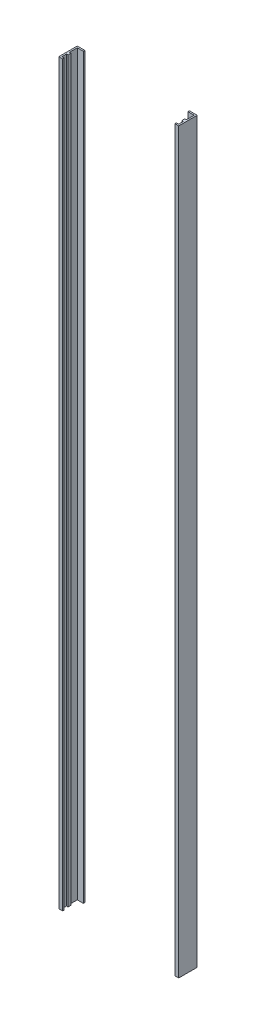
ISO-10303-21;
HEADER;
FILE_DESCRIPTION(('STEP AP214'),'2;1');
FILE_NAME('part.step','',(''),(''),'','','');
FILE_SCHEMA(('AUTOMOTIVE_DESIGN { 1 0 10303 214 1 1 1 1 }'));
ENDSEC;
DATA;
#1=APPLICATION_CONTEXT('core data for automotive mechanical design processes');
#2=APPLICATION_PROTOCOL_DEFINITION('international standard','automotive_design',2000,#1);
#3=PRODUCT_CONTEXT('',#1,'mechanical');
#4=PRODUCT('Part','Part','',(#3));
#5=PRODUCT_RELATED_PRODUCT_CATEGORY('part','',(#4));
#6=PRODUCT_DEFINITION_FORMATION('','',#4);
#7=PRODUCT_DEFINITION_CONTEXT('part definition',#1,'design');
#8=PRODUCT_DEFINITION('design','',#6,#7);
#9=PRODUCT_DEFINITION_SHAPE('','',#8);
#10=(LENGTH_UNIT() NAMED_UNIT(*) SI_UNIT(.MILLI.,.METRE.));
#11=(NAMED_UNIT(*) PLANE_ANGLE_UNIT() SI_UNIT($,.RADIAN.));
#12=(NAMED_UNIT(*) SI_UNIT($,.STERADIAN.) SOLID_ANGLE_UNIT());
#13=UNCERTAINTY_MEASURE_WITH_UNIT(LENGTH_MEASURE(1.E-05),#10,'distance_accuracy_value','');
#14=(GEOMETRIC_REPRESENTATION_CONTEXT(3) GLOBAL_UNCERTAINTY_ASSIGNED_CONTEXT((#13)) GLOBAL_UNIT_ASSIGNED_CONTEXT((#10,
#11,#12)) REPRESENTATION_CONTEXT('',''));
#15=CARTESIAN_POINT('',(0.,0.,0.));
#16=DIRECTION('',(0.,0.,1.));
#17=DIRECTION('',(1.,0.,0.));
#18=AXIS2_PLACEMENT_3D('',#15,#16,#17);
#19=CARTESIAN_POINT('',(92.71,1219.2,0.));
#20=DIRECTION('',(0.,0.,-1.));
#21=DIRECTION('',(-1.,0.,0.));
#22=AXIS2_PLACEMENT_3D('',#19,#20,#21);
#23=PLANE('',#22);
#24=DIRECTION('',(1.,0.,0.));
#25=VECTOR('',#24,1.);
#26=CARTESIAN_POINT('',(92.71,0.,0.));
#27=LINE('',#26,#25);
#28=CARTESIAN_POINT('',(92.71,0.,0.));
#29=VERTEX_POINT('',#28);
#30=CARTESIAN_POINT('',(99.06,0.,0.));
#31=VERTEX_POINT('',#30);
#32=EDGE_CURVE('E12',#29,#31,#27,.T.);
#33=ORIENTED_EDGE('',*,*,#32,.T.);
#34=DIRECTION('',(0.,-1.,0.));
#35=VECTOR('',#34,1.);
#36=CARTESIAN_POINT('',(99.06,1219.2,0.));
#37=LINE('',#36,#35);
#38=CARTESIAN_POINT('',(99.06,1219.2,0.));
#39=VERTEX_POINT('',#38);
#40=EDGE_CURVE('E380',#39,#31,#37,.T.);
#41=ORIENTED_EDGE('',*,*,#40,.F.);
#42=DIRECTION('',(1.,0.,0.));
#43=VECTOR('',#42,1.);
#44=CARTESIAN_POINT('',(92.71,1219.2,0.));
#45=LINE('',#44,#43);
#46=CARTESIAN_POINT('',(92.71,1219.2,0.));
#47=VERTEX_POINT('',#46);
#48=EDGE_CURVE('E51',#47,#39,#45,.T.);
#49=ORIENTED_EDGE('',*,*,#48,.F.);
#50=DIRECTION('',(0.,-1.,0.));
#51=VECTOR('',#50,1.);
#52=CARTESIAN_POINT('',(92.71,1219.2,0.));
#53=LINE('',#52,#51);
#54=EDGE_CURVE('E175',#47,#29,#53,.T.);
#55=ORIENTED_EDGE('',*,*,#54,.T.);
#56=EDGE_LOOP('',(#33,#41,#49,#55));
#57=FACE_BOUND('',#56,.T.);
#58=ADVANCED_FACE('F47',(#57),#23,.F.);
#59=CARTESIAN_POINT('',(99.06,1219.2,0.));
#60=DIRECTION('',(-1.,0.,0.));
#61=DIRECTION('',(0.,0.,1.));
#62=AXIS2_PLACEMENT_3D('',#59,#60,#61);
#63=PLANE('',#62);
#64=DIRECTION('',(0.,0.,-1.));
#65=VECTOR('',#64,1.);
#66=CARTESIAN_POINT('',(99.06,0.,0.));
#67=LINE('',#66,#65);
#68=CARTESIAN_POINT('',(99.06,0.,-30.48));
#69=VERTEX_POINT('',#68);
#70=EDGE_CURVE('E57',#31,#69,#67,.T.);
#71=ORIENTED_EDGE('',*,*,#70,.T.);
#72=DIRECTION('',(0.,-1.,0.));
#73=VECTOR('',#72,1.);
#74=CARTESIAN_POINT('',(99.06,1219.2,-30.48));
#75=LINE('',#74,#73);
#76=CARTESIAN_POINT('',(99.06,1219.2,-30.48));
#77=VERTEX_POINT('',#76);
#78=EDGE_CURVE('E150',#77,#69,#75,.T.);
#79=ORIENTED_EDGE('',*,*,#78,.F.);
#80=DIRECTION('',(0.,0.,-1.));
#81=VECTOR('',#80,1.);
#82=CARTESIAN_POINT('',(99.06,1219.2,0.));
#83=LINE('',#82,#81);
#84=EDGE_CURVE('E105',#39,#77,#83,.T.);
#85=ORIENTED_EDGE('',*,*,#84,.F.);
#86=ORIENTED_EDGE('',*,*,#40,.T.);
#87=EDGE_LOOP('',(#71,#79,#85,#86));
#88=FACE_BOUND('',#87,.T.);
#89=ADVANCED_FACE('F271',(#88),#63,.F.);
#90=CARTESIAN_POINT('',(92.71,1219.2,-30.48));
#91=DIRECTION('',(0.,0.,1.));
#92=DIRECTION('',(1.,0.,0.));
#93=AXIS2_PLACEMENT_3D('',#90,#91,#92);
#94=PLANE('',#93);
#95=DIRECTION('',(-1.,0.,0.));
#96=VECTOR('',#95,1.);
#97=CARTESIAN_POINT('',(92.71,0.,-30.48));
#98=LINE('',#97,#96);
#99=CARTESIAN_POINT('',(86.3599999999999,0.,-30.48));
#100=VERTEX_POINT('',#99);
#101=EDGE_CURVE('E144',#69,#100,#98,.T.);
#102=ORIENTED_EDGE('',*,*,#101,.T.);
#103=DIRECTION('',(0.,-1.,0.));
#104=VECTOR('',#103,1.);
#105=CARTESIAN_POINT('',(86.3599999999999,1219.2,-30.48));
#106=LINE('',#105,#104);
#107=CARTESIAN_POINT('',(86.3599999999999,1219.2,-30.48));
#108=VERTEX_POINT('',#107);
#109=EDGE_CURVE('E148',#108,#100,#106,.T.);
#110=ORIENTED_EDGE('',*,*,#109,.F.);
#111=DIRECTION('',(-1.,0.,0.));
#112=VECTOR('',#111,1.);
#113=CARTESIAN_POINT('',(99.06,1219.2,-30.48));
#114=LINE('',#113,#112);
#115=EDGE_CURVE('E196',#77,#108,#114,.T.);
#116=ORIENTED_EDGE('',*,*,#115,.F.);
#117=ORIENTED_EDGE('',*,*,#78,.T.);
#118=EDGE_LOOP('',(#102,#110,#116,#117));
#119=FACE_BOUND('',#118,.T.);
#120=ADVANCED_FACE('F146',(#119),#94,.F.);
#121=CARTESIAN_POINT('',(86.3599999999999,1219.2,-30.48));
#122=DIRECTION('',(1.,0.,0.));
#123=DIRECTION('',(0.,0.,-1.));
#124=AXIS2_PLACEMENT_3D('',#121,#122,#123);
#125=PLANE('',#124);
#126=DIRECTION('',(0.,0.,1.));
#127=VECTOR('',#126,1.);
#128=CARTESIAN_POINT('',(86.3599999999999,0.,-30.48));
#129=LINE('',#128,#127);
#130=CARTESIAN_POINT('',(86.3599999999999,0.,-27.94));
#131=VERTEX_POINT('',#130);
#132=EDGE_CURVE('E152',#100,#131,#129,.T.);
#133=ORIENTED_EDGE('',*,*,#132,.T.);
#134=DIRECTION('',(0.,-1.,0.));
#135=VECTOR('',#134,1.);
#136=CARTESIAN_POINT('',(86.3599999999999,1219.2,-27.94));
#137=LINE('',#136,#135);
#138=CARTESIAN_POINT('',(86.3599999999999,1219.2,-27.94));
#139=VERTEX_POINT('',#138);
#140=EDGE_CURVE('E160',#139,#131,#137,.T.);
#141=ORIENTED_EDGE('',*,*,#140,.F.);
#142=DIRECTION('',(0.,0.,1.));
#143=VECTOR('',#142,1.);
#144=CARTESIAN_POINT('',(86.3599999999999,1219.2,-30.48));
#145=LINE('',#144,#143);
#146=EDGE_CURVE('E159',#108,#139,#145,.T.);
#147=ORIENTED_EDGE('',*,*,#146,.F.);
#148=ORIENTED_EDGE('',*,*,#109,.T.);
#149=EDGE_LOOP('',(#133,#141,#147,#148));
#150=FACE_BOUND('',#149,.T.);
#151=ADVANCED_FACE('F156',(#150),#125,.F.);
#152=CARTESIAN_POINT('',(96.52,1219.2,-27.94));
#153=DIRECTION('',(0.,0.,1.));
#154=DIRECTION('',(1.,0.,0.));
#155=AXIS2_PLACEMENT_3D('',#152,#153,#154);
#156=PLANE('',#155);
#157=DIRECTION('',(-1.,0.,0.));
#158=VECTOR('',#157,1.);
#159=CARTESIAN_POINT('',(96.52,0.,-27.94));
#160=LINE('',#159,#158);
#161=CARTESIAN_POINT('',(96.52,0.,-27.94));
#162=VERTEX_POINT('',#161);
#163=EDGE_CURVE('E165',#162,#131,#160,.T.);
#164=ORIENTED_EDGE('',*,*,#163,.F.);
#165=DIRECTION('',(0.,-1.,0.));
#166=VECTOR('',#165,1.);
#167=CARTESIAN_POINT('',(96.52,1219.2,-27.94));
#168=LINE('',#167,#166);
#169=CARTESIAN_POINT('',(96.52,1219.2,-27.94));
#170=VERTEX_POINT('',#169);
#171=EDGE_CURVE('E224',#170,#162,#168,.T.);
#172=ORIENTED_EDGE('',*,*,#171,.F.);
#173=DIRECTION('',(1.,0.,0.));
#174=VECTOR('',#173,1.);
#175=CARTESIAN_POINT('',(86.3599999999999,1219.2,-27.94));
#176=LINE('',#175,#174);
#177=EDGE_CURVE('E193',#139,#170,#176,.T.);
#178=ORIENTED_EDGE('',*,*,#177,.F.);
#179=ORIENTED_EDGE('',*,*,#140,.T.);
#180=EDGE_LOOP('',(#164,#172,#178,#179));
#181=FACE_BOUND('',#180,.T.);
#182=ADVANCED_FACE('F228',(#181),#156,.T.);
#183=CARTESIAN_POINT('',(96.52,1219.2,-15.24));
#184=DIRECTION('',(-1.,0.,0.));
#185=DIRECTION('',(0.,0.,1.));
#186=AXIS2_PLACEMENT_3D('',#183,#184,#185);
#187=PLANE('',#186);
#188=DIRECTION('',(0.,0.,-1.));
#189=VECTOR('',#188,1.);
#190=CARTESIAN_POINT('',(96.52,0.,-15.24));
#191=LINE('',#190,#189);
#192=CARTESIAN_POINT('',(96.52,0.,-15.24));
#193=VERTEX_POINT('',#192);
#194=EDGE_CURVE('E167',#193,#162,#191,.T.);
#195=ORIENTED_EDGE('',*,*,#194,.F.);
#196=DIRECTION('',(0.,-1.,0.));
#197=VECTOR('',#196,1.);
#198=CARTESIAN_POINT('',(96.52,1219.2,-15.24));
#199=LINE('',#198,#197);
#200=CARTESIAN_POINT('',(96.52,1219.2,-15.24));
#201=VERTEX_POINT('',#200);
#202=EDGE_CURVE('E221',#201,#193,#199,.T.);
#203=ORIENTED_EDGE('',*,*,#202,.F.);
#204=DIRECTION('',(0.,0.,-1.));
#205=VECTOR('',#204,1.);
#206=CARTESIAN_POINT('',(96.52,1219.2,-15.24));
#207=LINE('',#206,#205);
#208=EDGE_CURVE('E190',#201,#170,#207,.T.);
#209=ORIENTED_EDGE('',*,*,#208,.T.);
#210=ORIENTED_EDGE('',*,*,#171,.T.);
#211=EDGE_LOOP('',(#195,#203,#209,#210));
#212=FACE_BOUND('',#211,.T.);
#213=ADVANCED_FACE('F220',(#212),#187,.T.);
#214=CARTESIAN_POINT('',(93.98,1219.2,-15.24));
#215=DIRECTION('',(0.,0.,-1.));
#216=DIRECTION('',(-1.,0.,0.));
#217=AXIS2_PLACEMENT_3D('',#214,#215,#216);
#218=PLANE('',#217);
#219=DIRECTION('',(1.,0.,0.));
#220=VECTOR('',#219,1.);
#221=CARTESIAN_POINT('',(93.98,0.,-15.24));
#222=LINE('',#221,#220);
#223=CARTESIAN_POINT('',(93.98,0.,-15.24));
#224=VERTEX_POINT('',#223);
#225=EDGE_CURVE('E215',#224,#193,#222,.T.);
#226=ORIENTED_EDGE('',*,*,#225,.F.);
#227=DIRECTION('',(0.,-1.,0.));
#228=VECTOR('',#227,1.);
#229=CARTESIAN_POINT('',(93.98,1219.2,-15.24));
#230=LINE('',#229,#228);
#231=CARTESIAN_POINT('',(93.98,1219.2,-15.24));
#232=VERTEX_POINT('',#231);
#233=EDGE_CURVE('E233',#232,#224,#230,.T.);
#234=ORIENTED_EDGE('',*,*,#233,.F.);
#235=DIRECTION('',(1.,0.,0.));
#236=VECTOR('',#235,1.);
#237=CARTESIAN_POINT('',(93.98,1219.2,-15.24));
#238=LINE('',#237,#236);
#239=EDGE_CURVE('E187',#232,#201,#238,.T.);
#240=ORIENTED_EDGE('',*,*,#239,.T.);
#241=ORIENTED_EDGE('',*,*,#202,.T.);
#242=EDGE_LOOP('',(#226,#234,#240,#241));
#243=FACE_BOUND('',#242,.T.);
#244=ADVANCED_FACE('F261',(#243),#218,.T.);
#245=CARTESIAN_POINT('',(93.98,1219.2,-10.16));
#246=DIRECTION('',(-1.,0.,0.));
#247=DIRECTION('',(0.,0.,1.));
#248=AXIS2_PLACEMENT_3D('',#245,#246,#247);
#249=PLANE('',#248);
#250=DIRECTION('',(0.,0.,-1.));
#251=VECTOR('',#250,1.);
#252=CARTESIAN_POINT('',(93.98,0.,-10.16));
#253=LINE('',#252,#251);
#254=CARTESIAN_POINT('',(93.98,0.,-10.16));
#255=VERTEX_POINT('',#254);
#256=EDGE_CURVE('E212',#255,#224,#253,.T.);
#257=ORIENTED_EDGE('',*,*,#256,.F.);
#258=DIRECTION('',(0.,-1.,0.));
#259=VECTOR('',#258,1.);
#260=CARTESIAN_POINT('',(93.98,1219.2,-10.16));
#261=LINE('',#260,#259);
#262=CARTESIAN_POINT('',(93.98,1219.2,-10.16));
#263=VERTEX_POINT('',#262);
#264=EDGE_CURVE('E235',#263,#255,#261,.T.);
#265=ORIENTED_EDGE('',*,*,#264,.F.);
#266=DIRECTION('',(0.,0.,-1.));
#267=VECTOR('',#266,1.);
#268=CARTESIAN_POINT('',(93.98,1219.2,-10.16));
#269=LINE('',#268,#267);
#270=EDGE_CURVE('E184',#263,#232,#269,.T.);
#271=ORIENTED_EDGE('',*,*,#270,.T.);
#272=ORIENTED_EDGE('',*,*,#233,.T.);
#273=EDGE_LOOP('',(#257,#265,#271,#272));
#274=FACE_BOUND('',#273,.T.);
#275=ADVANCED_FACE('F258',(#274),#249,.T.);
#276=CARTESIAN_POINT('',(96.52,1219.2,-10.16));
#277=DIRECTION('',(0.,0.,1.));
#278=DIRECTION('',(1.,0.,0.));
#279=AXIS2_PLACEMENT_3D('',#276,#277,#278);
#280=PLANE('',#279);
#281=DIRECTION('',(-1.,0.,0.));
#282=VECTOR('',#281,1.);
#283=CARTESIAN_POINT('',(96.52,0.,-10.16));
#284=LINE('',#283,#282);
#285=CARTESIAN_POINT('',(96.52,0.,-10.16));
#286=VERTEX_POINT('',#285);
#287=EDGE_CURVE('E209',#286,#255,#284,.T.);
#288=ORIENTED_EDGE('',*,*,#287,.F.);
#289=DIRECTION('',(0.,-1.,0.));
#290=VECTOR('',#289,1.);
#291=CARTESIAN_POINT('',(96.52,1219.2,-10.16));
#292=LINE('',#291,#290);
#293=CARTESIAN_POINT('',(96.52,1219.2,-10.16));
#294=VERTEX_POINT('',#293);
#295=EDGE_CURVE('E237',#294,#286,#292,.T.);
#296=ORIENTED_EDGE('',*,*,#295,.F.);
#297=DIRECTION('',(-1.,0.,0.));
#298=VECTOR('',#297,1.);
#299=CARTESIAN_POINT('',(96.52,1219.2,-10.16));
#300=LINE('',#299,#298);
#301=EDGE_CURVE('E181',#294,#263,#300,.T.);
#302=ORIENTED_EDGE('',*,*,#301,.T.);
#303=ORIENTED_EDGE('',*,*,#264,.T.);
#304=EDGE_LOOP('',(#288,#296,#302,#303));
#305=FACE_BOUND('',#304,.T.);
#306=ADVANCED_FACE('F254',(#305),#280,.T.);
#307=CARTESIAN_POINT('',(96.52,1219.2,-2.53999999999999));
#308=DIRECTION('',(-1.,0.,0.));
#309=DIRECTION('',(0.,0.,1.));
#310=AXIS2_PLACEMENT_3D('',#307,#308,#309);
#311=PLANE('',#310);
#312=DIRECTION('',(0.,0.,-1.));
#313=VECTOR('',#312,1.);
#314=CARTESIAN_POINT('',(96.52,0.,-2.53999999999999));
#315=LINE('',#314,#313);
#316=CARTESIAN_POINT('',(96.52,0.,-2.53999999999999));
#317=VERTEX_POINT('',#316);
#318=EDGE_CURVE('E202',#317,#286,#315,.T.);
#319=ORIENTED_EDGE('',*,*,#318,.F.);
#320=DIRECTION('',(0.,-1.,0.));
#321=VECTOR('',#320,1.);
#322=CARTESIAN_POINT('',(96.52,1219.2,-2.53999999999999));
#323=LINE('',#322,#321);
#324=CARTESIAN_POINT('',(96.52,1219.2,-2.53999999999999));
#325=VERTEX_POINT('',#324);
#326=EDGE_CURVE('E239',#325,#317,#323,.T.);
#327=ORIENTED_EDGE('',*,*,#326,.F.);
#328=DIRECTION('',(0.,0.,-1.));
#329=VECTOR('',#328,1.);
#330=CARTESIAN_POINT('',(96.52,1219.2,-2.53999999999999));
#331=LINE('',#330,#329);
#332=EDGE_CURVE('E178',#325,#294,#331,.T.);
#333=ORIENTED_EDGE('',*,*,#332,.T.);
#334=ORIENTED_EDGE('',*,*,#295,.T.);
#335=EDGE_LOOP('',(#319,#327,#333,#334));
#336=FACE_BOUND('',#335,.T.);
#337=ADVANCED_FACE('F250',(#336),#311,.T.);
#338=CARTESIAN_POINT('',(92.71,1219.2,-2.53999999999999));
#339=DIRECTION('',(0.,0.,-1.));
#340=DIRECTION('',(-1.,0.,0.));
#341=AXIS2_PLACEMENT_3D('',#338,#339,#340);
#342=PLANE('',#341);
#343=DIRECTION('',(1.,0.,0.));
#344=VECTOR('',#343,1.);
#345=CARTESIAN_POINT('',(92.71,0.,-2.53999999999999));
#346=LINE('',#345,#344);
#347=CARTESIAN_POINT('',(92.71,0.,-2.53999999999999));
#348=VERTEX_POINT('',#347);
#349=EDGE_CURVE('E199',#348,#317,#346,.T.);
#350=ORIENTED_EDGE('',*,*,#349,.F.);
#351=DIRECTION('',(0.,-1.,0.));
#352=VECTOR('',#351,1.);
#353=CARTESIAN_POINT('',(92.71,1219.2,-2.53999999999999));
#354=LINE('',#353,#352);
#355=CARTESIAN_POINT('',(92.71,1219.2,-2.53999999999999));
#356=VERTEX_POINT('',#355);
#357=EDGE_CURVE('E240',#356,#348,#354,.T.);
#358=ORIENTED_EDGE('',*,*,#357,.F.);
#359=DIRECTION('',(1.,0.,0.));
#360=VECTOR('',#359,1.);
#361=CARTESIAN_POINT('',(92.71,1219.2,-2.53999999999999));
#362=LINE('',#361,#360);
#363=EDGE_CURVE('E174',#356,#325,#362,.T.);
#364=ORIENTED_EDGE('',*,*,#363,.T.);
#365=ORIENTED_EDGE('',*,*,#326,.T.);
#366=EDGE_LOOP('',(#350,#358,#364,#365));
#367=FACE_BOUND('',#366,.T.);
#368=ADVANCED_FACE('F245',(#367),#342,.T.);
#369=CARTESIAN_POINT('',(92.71,1219.2,-2.53999999999999));
#370=DIRECTION('',(1.,0.,0.));
#371=DIRECTION('',(0.,0.,-1.));
#372=AXIS2_PLACEMENT_3D('',#369,#370,#371);
#373=PLANE('',#372);
#374=DIRECTION('',(0.,0.,1.));
#375=VECTOR('',#374,1.);
#376=CARTESIAN_POINT('',(92.71,0.,-2.53999999999999));
#377=LINE('',#376,#375);
#378=EDGE_CURVE('E116',#348,#29,#377,.T.);
#379=ORIENTED_EDGE('',*,*,#378,.T.);
#380=ORIENTED_EDGE('',*,*,#54,.F.);
#381=DIRECTION('',(0.,0.,1.));
#382=VECTOR('',#381,1.);
#383=CARTESIAN_POINT('',(92.71,1219.2,-2.53999999999999));
#384=LINE('',#383,#382);
#385=EDGE_CURVE('E172',#356,#47,#384,.T.);
#386=ORIENTED_EDGE('',*,*,#385,.F.);
#387=ORIENTED_EDGE('',*,*,#357,.T.);
#388=EDGE_LOOP('',(#379,#380,#386,#387));
#389=FACE_BOUND('',#388,.T.);
#390=ADVANCED_FACE('F262',(#389),#373,.F.);
#391=CARTESIAN_POINT('',(0.,1219.2,0.));
#392=DIRECTION('',(0.,1.,0.));
#393=DIRECTION('',(0.,0.,1.));
#394=AXIS2_PLACEMENT_3D('',#391,#392,#393);
#395=PLANE('',#394);
#396=ORIENTED_EDGE('',*,*,#48,.T.);
#397=ORIENTED_EDGE('',*,*,#84,.T.);
#398=ORIENTED_EDGE('',*,*,#115,.T.);
#399=ORIENTED_EDGE('',*,*,#146,.T.);
#400=ORIENTED_EDGE('',*,*,#177,.T.);
#401=ORIENTED_EDGE('',*,*,#208,.F.);
#402=ORIENTED_EDGE('',*,*,#239,.F.);
#403=ORIENTED_EDGE('',*,*,#270,.F.);
#404=ORIENTED_EDGE('',*,*,#301,.F.);
#405=ORIENTED_EDGE('',*,*,#332,.F.);
#406=ORIENTED_EDGE('',*,*,#363,.F.);
#407=ORIENTED_EDGE('',*,*,#385,.T.);
#408=EDGE_LOOP('',(#396,#397,#398,#399,#400,#401,#402,#403,#404,#405,#406,#407));
#409=FACE_BOUND('',#408,.T.);
#410=ADVANCED_FACE('F49',(#409),#395,.T.);
#411=CARTESIAN_POINT('',(0.,0.,0.));
#412=DIRECTION('',(0.,1.,0.));
#413=DIRECTION('',(0.,0.,1.));
#414=AXIS2_PLACEMENT_3D('',#411,#412,#413);
#415=PLANE('',#414);
#416=ORIENTED_EDGE('',*,*,#32,.F.);
#417=ORIENTED_EDGE('',*,*,#378,.F.);
#418=ORIENTED_EDGE('',*,*,#349,.T.);
#419=ORIENTED_EDGE('',*,*,#318,.T.);
#420=ORIENTED_EDGE('',*,*,#287,.T.);
#421=ORIENTED_EDGE('',*,*,#256,.T.);
#422=ORIENTED_EDGE('',*,*,#225,.T.);
#423=ORIENTED_EDGE('',*,*,#194,.T.);
#424=ORIENTED_EDGE('',*,*,#163,.T.);
#425=ORIENTED_EDGE('',*,*,#132,.F.);
#426=ORIENTED_EDGE('',*,*,#101,.F.);
#427=ORIENTED_EDGE('',*,*,#70,.F.);
#428=EDGE_LOOP('',(#416,#417,#418,#419,#420,#421,#422,#423,#424,#425,#426,#427));
#429=FACE_BOUND('',#428,.T.);
#430=ADVANCED_FACE('F162',(#429),#415,.F.);
#431=CLOSED_SHELL('',(#58,#89,#120,#151,#182,#213,#244,#275,#306,#337,#368,#390,#410,#430));
#432=MANIFOLD_SOLID_BREP('B2',#431);
#433=CARTESIAN_POINT('',(-86.36,1219.2,0.));
#434=DIRECTION('',(1.,0.,0.));
#435=DIRECTION('',(0.,0.,-1.));
#436=AXIS2_PLACEMENT_3D('',#433,#434,#435);
#437=PLANE('',#436);
#438=DIRECTION('',(0.,0.,1.));
#439=VECTOR('',#438,1.);
#440=CARTESIAN_POINT('',(-86.36,0.,0.));
#441=LINE('',#440,#439);
#442=CARTESIAN_POINT('',(-86.36,0.,-30.48));
#443=VERTEX_POINT('',#442);
#444=CARTESIAN_POINT('',(-86.36,0.,-27.94));
#445=VERTEX_POINT('',#444);
#446=EDGE_CURVE('E501',#443,#445,#441,.T.);
#447=ORIENTED_EDGE('',*,*,#446,.F.);
#448=DIRECTION('',(0.,-1.,0.));
#449=VECTOR('',#448,1.);
#450=CARTESIAN_POINT('',(-86.36,1219.2,-30.48));
#451=LINE('',#450,#449);
#452=CARTESIAN_POINT('',(-86.36,1219.2,-30.48));
#453=VERTEX_POINT('',#452);
#454=EDGE_CURVE('E45',#453,#443,#451,.T.);
#455=ORIENTED_EDGE('',*,*,#454,.F.);
#456=DIRECTION('',(0.,0.,1.));
#457=VECTOR('',#456,1.);
#458=CARTESIAN_POINT('',(-86.36,1219.2,0.));
#459=LINE('',#458,#457);
#460=CARTESIAN_POINT('',(-86.36,1219.2,-27.94));
#461=VERTEX_POINT('',#460);
#462=EDGE_CURVE('E528',#453,#461,#459,.T.);
#463=ORIENTED_EDGE('',*,*,#462,.T.);
#464=DIRECTION('',(0.,-1.,0.));
#465=VECTOR('',#464,1.);
#466=CARTESIAN_POINT('',(-86.36,1219.2,-27.94));
#467=LINE('',#466,#465);
#468=EDGE_CURVE('E448',#461,#445,#467,.T.);
#469=ORIENTED_EDGE('',*,*,#468,.T.);
#470=EDGE_LOOP('',(#447,#455,#463,#469));
#471=FACE_BOUND('',#470,.T.);
#472=ADVANCED_FACE('F385',(#471),#437,.T.);
#473=CARTESIAN_POINT('',(0.,1219.2,-30.48));
#474=DIRECTION('',(0.,0.,-1.));
#475=DIRECTION('',(-1.,0.,0.));
#476=AXIS2_PLACEMENT_3D('',#473,#474,#475);
#477=PLANE('',#476);
#478=DIRECTION('',(1.,0.,0.));
#479=VECTOR('',#478,1.);
#480=CARTESIAN_POINT('',(0.,0.,-30.48));
#481=LINE('',#480,#479);
#482=CARTESIAN_POINT('',(-99.06,0.,-30.48));
#483=VERTEX_POINT('',#482);
#484=EDGE_CURVE('E504',#483,#443,#481,.T.);
#485=ORIENTED_EDGE('',*,*,#484,.F.);
#486=DIRECTION('',(0.,-1.,0.));
#487=VECTOR('',#486,1.);
#488=CARTESIAN_POINT('',(-99.06,1219.2,-30.48));
#489=LINE('',#488,#487);
#490=CARTESIAN_POINT('',(-99.06,1219.2,-30.48));
#491=VERTEX_POINT('',#490);
#492=EDGE_CURVE('E393',#491,#483,#489,.T.);
#493=ORIENTED_EDGE('',*,*,#492,.F.);
#494=DIRECTION('',(1.,0.,0.));
#495=VECTOR('',#494,1.);
#496=CARTESIAN_POINT('',(0.,1219.2,-30.48));
#497=LINE('',#496,#495);
#498=EDGE_CURVE('E569',#491,#453,#497,.T.);
#499=ORIENTED_EDGE('',*,*,#498,.T.);
#500=ORIENTED_EDGE('',*,*,#454,.T.);
#501=EDGE_LOOP('',(#485,#493,#499,#500));
#502=FACE_BOUND('',#501,.T.);
#503=ADVANCED_FACE('F556',(#502),#477,.T.);
#504=CARTESIAN_POINT('',(-99.06,1219.2,0.));
#505=DIRECTION('',(-1.,0.,0.));
#506=DIRECTION('',(0.,0.,1.));
#507=AXIS2_PLACEMENT_3D('',#504,#505,#506);
#508=PLANE('',#507);
#509=DIRECTION('',(0.,0.,-1.));
#510=VECTOR('',#509,1.);
#511=CARTESIAN_POINT('',(-99.06,0.,0.));
#512=LINE('',#511,#510);
#513=CARTESIAN_POINT('',(-99.06,0.,0.));
#514=VERTEX_POINT('',#513);
#515=EDGE_CURVE('E507',#514,#483,#512,.T.);
#516=ORIENTED_EDGE('',*,*,#515,.F.);
#517=DIRECTION('',(0.,-1.,0.));
#518=VECTOR('',#517,1.);
#519=CARTESIAN_POINT('',(-99.06,1219.2,0.));
#520=LINE('',#519,#518);
#521=CARTESIAN_POINT('',(-99.06,1219.2,0.));
#522=VERTEX_POINT('',#521);
#523=EDGE_CURVE('E545',#522,#514,#520,.T.);
#524=ORIENTED_EDGE('',*,*,#523,.F.);
#525=DIRECTION('',(0.,0.,-1.));
#526=VECTOR('',#525,1.);
#527=CARTESIAN_POINT('',(-99.06,1219.2,0.));
#528=LINE('',#527,#526);
#529=EDGE_CURVE('E552',#522,#491,#528,.T.);
#530=ORIENTED_EDGE('',*,*,#529,.T.);
#531=ORIENTED_EDGE('',*,*,#492,.T.);
#532=EDGE_LOOP('',(#516,#524,#530,#531));
#533=FACE_BOUND('',#532,.T.);
#534=ADVANCED_FACE('F550',(#533),#508,.T.);
#535=CARTESIAN_POINT('',(0.,1219.2,-5.19930285413798E-13));
#536=DIRECTION('',(0.,0.,1.));
#537=DIRECTION('',(1.,0.,0.));
#538=AXIS2_PLACEMENT_3D('',#535,#536,#537);
#539=PLANE('',#538);
#540=DIRECTION('',(-1.,0.,0.));
#541=VECTOR('',#540,1.);
#542=CARTESIAN_POINT('',(0.,0.,-5.19930285413798E-13));
#543=LINE('',#542,#541);
#544=CARTESIAN_POINT('',(-92.71,0.,0.));
#545=VERTEX_POINT('',#544);
#546=EDGE_CURVE('E510',#545,#514,#543,.T.);
#547=ORIENTED_EDGE('',*,*,#546,.F.);
#548=DIRECTION('',(0.,-1.,0.));
#549=VECTOR('',#548,1.);
#550=CARTESIAN_POINT('',(-92.71,1219.2,0.));
#551=LINE('',#550,#549);
#552=CARTESIAN_POINT('',(-92.71,1219.2,0.));
#553=VERTEX_POINT('',#552);
#554=EDGE_CURVE('E543',#553,#545,#551,.T.);
#555=ORIENTED_EDGE('',*,*,#554,.F.);
#556=DIRECTION('',(-1.,0.,0.));
#557=VECTOR('',#556,1.);
#558=CARTESIAN_POINT('',(0.,1219.2,-5.19930285413798E-13));
#559=LINE('',#558,#557);
#560=EDGE_CURVE('E566',#553,#522,#559,.T.);
#561=ORIENTED_EDGE('',*,*,#560,.T.);
#562=ORIENTED_EDGE('',*,*,#523,.T.);
#563=EDGE_LOOP('',(#547,#555,#561,#562));
#564=FACE_BOUND('',#563,.T.);
#565=ADVANCED_FACE('F563',(#564),#539,.T.);
#566=CARTESIAN_POINT('',(-92.71,1219.2,0.));
#567=DIRECTION('',(1.,0.,0.));
#568=DIRECTION('',(0.,0.,-1.));
#569=AXIS2_PLACEMENT_3D('',#566,#567,#568);
#570=PLANE('',#569);
#571=DIRECTION('',(0.,0.,1.));
#572=VECTOR('',#571,1.);
#573=CARTESIAN_POINT('',(-92.71,0.,0.));
#574=LINE('',#573,#572);
#575=CARTESIAN_POINT('',(-92.71,0.,-2.54));
#576=VERTEX_POINT('',#575);
#577=EDGE_CURVE('E513',#576,#545,#574,.T.);
#578=ORIENTED_EDGE('',*,*,#577,.F.);
#579=DIRECTION('',(0.,-1.,0.));
#580=VECTOR('',#579,1.);
#581=CARTESIAN_POINT('',(-92.71,1219.2,-2.54));
#582=LINE('',#581,#580);
#583=CARTESIAN_POINT('',(-92.71,1219.2,-2.54));
#584=VERTEX_POINT('',#583);
#585=EDGE_CURVE('E541',#584,#576,#582,.T.);
#586=ORIENTED_EDGE('',*,*,#585,.F.);
#587=DIRECTION('',(0.,0.,1.));
#588=VECTOR('',#587,1.);
#589=CARTESIAN_POINT('',(-92.71,1219.2,0.));
#590=LINE('',#589,#588);
#591=EDGE_CURVE('E571',#584,#553,#590,.T.);
#592=ORIENTED_EDGE('',*,*,#591,.T.);
#593=ORIENTED_EDGE('',*,*,#554,.T.);
#594=EDGE_LOOP('',(#578,#586,#592,#593));
#595=FACE_BOUND('',#594,.T.);
#596=ADVANCED_FACE('F606',(#595),#570,.T.);
#597=CARTESIAN_POINT('',(0.,1219.2,-2.54000000000001));
#598=DIRECTION('',(0.,0.,1.));
#599=DIRECTION('',(1.,0.,0.));
#600=AXIS2_PLACEMENT_3D('',#597,#598,#599);
#601=PLANE('',#600);
#602=DIRECTION('',(-1.,0.,0.));
#603=VECTOR('',#602,1.);
#604=CARTESIAN_POINT('',(0.,0.,-2.54000000000001));
#605=LINE('',#604,#603);
#606=CARTESIAN_POINT('',(-96.52,0.,-2.54));
#607=VERTEX_POINT('',#606);
#608=EDGE_CURVE('E516',#576,#607,#605,.T.);
#609=ORIENTED_EDGE('',*,*,#608,.T.);
#610=DIRECTION('',(0.,-1.,0.));
#611=VECTOR('',#610,1.);
#612=CARTESIAN_POINT('',(-96.52,1219.2,-2.54));
#613=LINE('',#612,#611);
#614=CARTESIAN_POINT('',(-96.52,1219.2,-2.54));
#615=VERTEX_POINT('',#614);
#616=EDGE_CURVE('E538',#615,#607,#613,.T.);
#617=ORIENTED_EDGE('',*,*,#616,.F.);
#618=DIRECTION('',(-1.,0.,0.));
#619=VECTOR('',#618,1.);
#620=CARTESIAN_POINT('',(0.,1219.2,-2.54000000000001));
#621=LINE('',#620,#619);
#622=EDGE_CURVE('E577',#584,#615,#621,.T.);
#623=ORIENTED_EDGE('',*,*,#622,.F.);
#624=ORIENTED_EDGE('',*,*,#585,.T.);
#625=EDGE_LOOP('',(#609,#617,#623,#624));
#626=FACE_BOUND('',#625,.T.);
#627=ADVANCED_FACE('F609',(#626),#601,.F.);
#628=CARTESIAN_POINT('',(-96.52,1219.2,0.));
#629=DIRECTION('',(-1.,0.,0.));
#630=DIRECTION('',(0.,0.,1.));
#631=AXIS2_PLACEMENT_3D('',#628,#629,#630);
#632=PLANE('',#631);
#633=DIRECTION('',(0.,0.,-1.));
#634=VECTOR('',#633,1.);
#635=CARTESIAN_POINT('',(-96.52,0.,0.));
#636=LINE('',#635,#634);
#637=CARTESIAN_POINT('',(-96.52,0.,-10.16));
#638=VERTEX_POINT('',#637);
#639=EDGE_CURVE('E518',#607,#638,#636,.T.);
#640=ORIENTED_EDGE('',*,*,#639,.T.);
#641=DIRECTION('',(0.,-1.,0.));
#642=VECTOR('',#641,1.);
#643=CARTESIAN_POINT('',(-96.52,1219.2,-10.16));
#644=LINE('',#643,#642);
#645=CARTESIAN_POINT('',(-96.52,1219.2,-10.16));
#646=VERTEX_POINT('',#645);
#647=EDGE_CURVE('E535',#646,#638,#644,.T.);
#648=ORIENTED_EDGE('',*,*,#647,.F.);
#649=DIRECTION('',(0.,0.,-1.));
#650=VECTOR('',#649,1.);
#651=CARTESIAN_POINT('',(-96.52,1219.2,0.));
#652=LINE('',#651,#650);
#653=EDGE_CURVE('E579',#615,#646,#652,.T.);
#654=ORIENTED_EDGE('',*,*,#653,.F.);
#655=ORIENTED_EDGE('',*,*,#616,.T.);
#656=EDGE_LOOP('',(#640,#648,#654,#655));
#657=FACE_BOUND('',#656,.T.);
#658=ADVANCED_FACE('F613',(#657),#632,.F.);
#659=CARTESIAN_POINT('',(0.,1219.2,-10.1599999999999));
#660=DIRECTION('',(0.,0.,-1.));
#661=DIRECTION('',(-1.,0.,0.));
#662=AXIS2_PLACEMENT_3D('',#659,#660,#661);
#663=PLANE('',#662);
#664=DIRECTION('',(1.,0.,0.));
#665=VECTOR('',#664,1.);
#666=CARTESIAN_POINT('',(0.,0.,-10.1599999999999));
#667=LINE('',#666,#665);
#668=CARTESIAN_POINT('',(-93.98,0.,-10.16));
#669=VERTEX_POINT('',#668);
#670=EDGE_CURVE('E520',#638,#669,#667,.T.);
#671=ORIENTED_EDGE('',*,*,#670,.T.);
#672=DIRECTION('',(0.,-1.,0.));
#673=VECTOR('',#672,1.);
#674=CARTESIAN_POINT('',(-93.98,1219.2,-10.16));
#675=LINE('',#674,#673);
#676=CARTESIAN_POINT('',(-93.98,1219.2,-10.16));
#677=VERTEX_POINT('',#676);
#678=EDGE_CURVE('E532',#677,#669,#675,.T.);
#679=ORIENTED_EDGE('',*,*,#678,.F.);
#680=DIRECTION('',(1.,0.,0.));
#681=VECTOR('',#680,1.);
#682=CARTESIAN_POINT('',(0.,1219.2,-10.1599999999999));
#683=LINE('',#682,#681);
#684=EDGE_CURVE('E581',#646,#677,#683,.T.);
#685=ORIENTED_EDGE('',*,*,#684,.F.);
#686=ORIENTED_EDGE('',*,*,#647,.T.);
#687=EDGE_LOOP('',(#671,#679,#685,#686));
#688=FACE_BOUND('',#687,.T.);
#689=ADVANCED_FACE('F587',(#688),#663,.F.);
#690=CARTESIAN_POINT('',(-93.98,1219.2,0.));
#691=DIRECTION('',(-1.,0.,0.));
#692=DIRECTION('',(0.,0.,1.));
#693=AXIS2_PLACEMENT_3D('',#690,#691,#692);
#694=PLANE('',#693);
#695=DIRECTION('',(0.,0.,-1.));
#696=VECTOR('',#695,1.);
#697=CARTESIAN_POINT('',(-93.98,0.,0.));
#698=LINE('',#697,#696);
#699=CARTESIAN_POINT('',(-93.98,0.,-15.24));
#700=VERTEX_POINT('',#699);
#701=EDGE_CURVE('E522',#669,#700,#698,.T.);
#702=ORIENTED_EDGE('',*,*,#701,.T.);
#703=DIRECTION('',(0.,-1.,0.));
#704=VECTOR('',#703,1.);
#705=CARTESIAN_POINT('',(-93.98,1219.2,-15.24));
#706=LINE('',#705,#704);
#707=CARTESIAN_POINT('',(-93.98,1219.2,-15.24));
#708=VERTEX_POINT('',#707);
#709=EDGE_CURVE('E493',#708,#700,#706,.T.);
#710=ORIENTED_EDGE('',*,*,#709,.F.);
#711=DIRECTION('',(0.,0.,-1.));
#712=VECTOR('',#711,1.);
#713=CARTESIAN_POINT('',(-93.98,1219.2,0.));
#714=LINE('',#713,#712);
#715=EDGE_CURVE('E484',#677,#708,#714,.T.);
#716=ORIENTED_EDGE('',*,*,#715,.F.);
#717=ORIENTED_EDGE('',*,*,#678,.T.);
#718=EDGE_LOOP('',(#702,#710,#716,#717));
#719=FACE_BOUND('',#718,.T.);
#720=ADVANCED_FACE('F591',(#719),#694,.F.);
#721=CARTESIAN_POINT('',(0.,1219.2,-15.2400000000001));
#722=DIRECTION('',(0.,0.,1.));
#723=DIRECTION('',(1.,0.,0.));
#724=AXIS2_PLACEMENT_3D('',#721,#722,#723);
#725=PLANE('',#724);
#726=DIRECTION('',(-1.,0.,0.));
#727=VECTOR('',#726,1.);
#728=CARTESIAN_POINT('',(0.,0.,-15.2400000000001));
#729=LINE('',#728,#727);
#730=CARTESIAN_POINT('',(-96.52,0.,-15.24));
#731=VERTEX_POINT('',#730);
#732=EDGE_CURVE('E492',#700,#731,#729,.T.);
#733=ORIENTED_EDGE('',*,*,#732,.T.);
#734=DIRECTION('',(0.,-1.,0.));
#735=VECTOR('',#734,1.);
#736=CARTESIAN_POINT('',(-96.52,1219.2,-15.24));
#737=LINE('',#736,#735);
#738=CARTESIAN_POINT('',(-96.52,1219.2,-15.24));
#739=VERTEX_POINT('',#738);
#740=EDGE_CURVE('E489',#739,#731,#737,.T.);
#741=ORIENTED_EDGE('',*,*,#740,.F.);
#742=DIRECTION('',(-1.,0.,0.));
#743=VECTOR('',#742,1.);
#744=CARTESIAN_POINT('',(0.,1219.2,-15.2400000000001));
#745=LINE('',#744,#743);
#746=EDGE_CURVE('E478',#708,#739,#745,.T.);
#747=ORIENTED_EDGE('',*,*,#746,.F.);
#748=ORIENTED_EDGE('',*,*,#709,.T.);
#749=EDGE_LOOP('',(#733,#741,#747,#748));
#750=FACE_BOUND('',#749,.T.);
#751=ADVANCED_FACE('F490',(#750),#725,.F.);
#752=CARTESIAN_POINT('',(-96.52,1219.2,0.));
#753=DIRECTION('',(-1.,0.,0.));
#754=DIRECTION('',(0.,0.,1.));
#755=AXIS2_PLACEMENT_3D('',#752,#753,#754);
#756=PLANE('',#755);
#757=DIRECTION('',(0.,0.,-1.));
#758=VECTOR('',#757,1.);
#759=CARTESIAN_POINT('',(-96.52,0.,0.));
#760=LINE('',#759,#758);
#761=CARTESIAN_POINT('',(-96.52,0.,-27.94));
#762=VERTEX_POINT('',#761);
#763=EDGE_CURVE('E441',#731,#762,#760,.T.);
#764=ORIENTED_EDGE('',*,*,#763,.T.);
#765=DIRECTION('',(0.,-1.,0.));
#766=VECTOR('',#765,1.);
#767=CARTESIAN_POINT('',(-96.52,1219.2,-27.94));
#768=LINE('',#767,#766);
#769=CARTESIAN_POINT('',(-96.52,1219.2,-27.94));
#770=VERTEX_POINT('',#769);
#771=EDGE_CURVE('E494',#770,#762,#768,.T.);
#772=ORIENTED_EDGE('',*,*,#771,.F.);
#773=DIRECTION('',(0.,0.,-1.));
#774=VECTOR('',#773,1.);
#775=CARTESIAN_POINT('',(-96.52,1219.2,0.));
#776=LINE('',#775,#774);
#777=EDGE_CURVE('E482',#739,#770,#776,.T.);
#778=ORIENTED_EDGE('',*,*,#777,.F.);
#779=ORIENTED_EDGE('',*,*,#740,.T.);
#780=EDGE_LOOP('',(#764,#772,#778,#779));
#781=FACE_BOUND('',#780,.T.);
#782=ADVANCED_FACE('F496',(#781),#756,.F.);
#783=CARTESIAN_POINT('',(0.,1219.2,-27.94));
#784=DIRECTION('',(0.,0.,-1.));
#785=DIRECTION('',(-1.,0.,0.));
#786=AXIS2_PLACEMENT_3D('',#783,#784,#785);
#787=PLANE('',#786);
#788=DIRECTION('',(1.,0.,0.));
#789=VECTOR('',#788,1.);
#790=CARTESIAN_POINT('',(0.,0.,-27.94));
#791=LINE('',#790,#789);
#792=EDGE_CURVE('E526',#762,#445,#791,.T.);
#793=ORIENTED_EDGE('',*,*,#792,.T.);
#794=ORIENTED_EDGE('',*,*,#468,.F.);
#795=DIRECTION('',(1.,0.,0.));
#796=VECTOR('',#795,1.);
#797=CARTESIAN_POINT('',(0.,1219.2,-27.94));
#798=LINE('',#797,#796);
#799=EDGE_CURVE('E401',#770,#461,#798,.T.);
#800=ORIENTED_EDGE('',*,*,#799,.F.);
#801=ORIENTED_EDGE('',*,*,#771,.T.);
#802=EDGE_LOOP('',(#793,#794,#800,#801));
#803=FACE_BOUND('',#802,.T.);
#804=ADVANCED_FACE('F594',(#803),#787,.F.);
#805=CARTESIAN_POINT('',(0.,1219.2,0.));
#806=DIRECTION('',(0.,1.,0.));
#807=DIRECTION('',(0.,0.,1.));
#808=AXIS2_PLACEMENT_3D('',#805,#806,#807);
#809=PLANE('',#808);
#810=ORIENTED_EDGE('',*,*,#462,.F.);
#811=ORIENTED_EDGE('',*,*,#498,.F.);
#812=ORIENTED_EDGE('',*,*,#529,.F.);
#813=ORIENTED_EDGE('',*,*,#560,.F.);
#814=ORIENTED_EDGE('',*,*,#591,.F.);
#815=ORIENTED_EDGE('',*,*,#622,.T.);
#816=ORIENTED_EDGE('',*,*,#653,.T.);
#817=ORIENTED_EDGE('',*,*,#684,.T.);
#818=ORIENTED_EDGE('',*,*,#715,.T.);
#819=ORIENTED_EDGE('',*,*,#746,.T.);
#820=ORIENTED_EDGE('',*,*,#777,.T.);
#821=ORIENTED_EDGE('',*,*,#799,.T.);
#822=EDGE_LOOP('',(#810,#811,#812,#813,#814,#815,#816,#817,#818,#819,#820,#821));
#823=FACE_BOUND('',#822,.T.);
#824=ADVANCED_FACE('F480',(#823),#809,.T.);
#825=CARTESIAN_POINT('',(0.,0.,0.));
#826=DIRECTION('',(0.,1.,0.));
#827=DIRECTION('',(0.,0.,1.));
#828=AXIS2_PLACEMENT_3D('',#825,#826,#827);
#829=PLANE('',#828);
#830=ORIENTED_EDGE('',*,*,#446,.T.);
#831=ORIENTED_EDGE('',*,*,#792,.F.);
#832=ORIENTED_EDGE('',*,*,#763,.F.);
#833=ORIENTED_EDGE('',*,*,#732,.F.);
#834=ORIENTED_EDGE('',*,*,#701,.F.);
#835=ORIENTED_EDGE('',*,*,#670,.F.);
#836=ORIENTED_EDGE('',*,*,#639,.F.);
#837=ORIENTED_EDGE('',*,*,#608,.F.);
#838=ORIENTED_EDGE('',*,*,#577,.T.);
#839=ORIENTED_EDGE('',*,*,#546,.T.);
#840=ORIENTED_EDGE('',*,*,#515,.T.);
#841=ORIENTED_EDGE('',*,*,#484,.T.);
#842=EDGE_LOOP('',(#830,#831,#832,#833,#834,#835,#836,#837,#838,#839,#840,#841));
#843=FACE_BOUND('',#842,.T.);
#844=ADVANCED_FACE('F558',(#843),#829,.F.);
#845=CLOSED_SHELL('',(#472,#503,#534,#565,#596,#627,#658,#689,#720,#751,#782,#804,#824,#844));
#846=MANIFOLD_SOLID_BREP('B6',#845);
#847=ADVANCED_BREP_SHAPE_REPRESENTATION('',(#18,#432,#846),#14);
#848=SHAPE_DEFINITION_REPRESENTATION(#9,#847);
ENDSEC;
END-ISO-10303-21;
